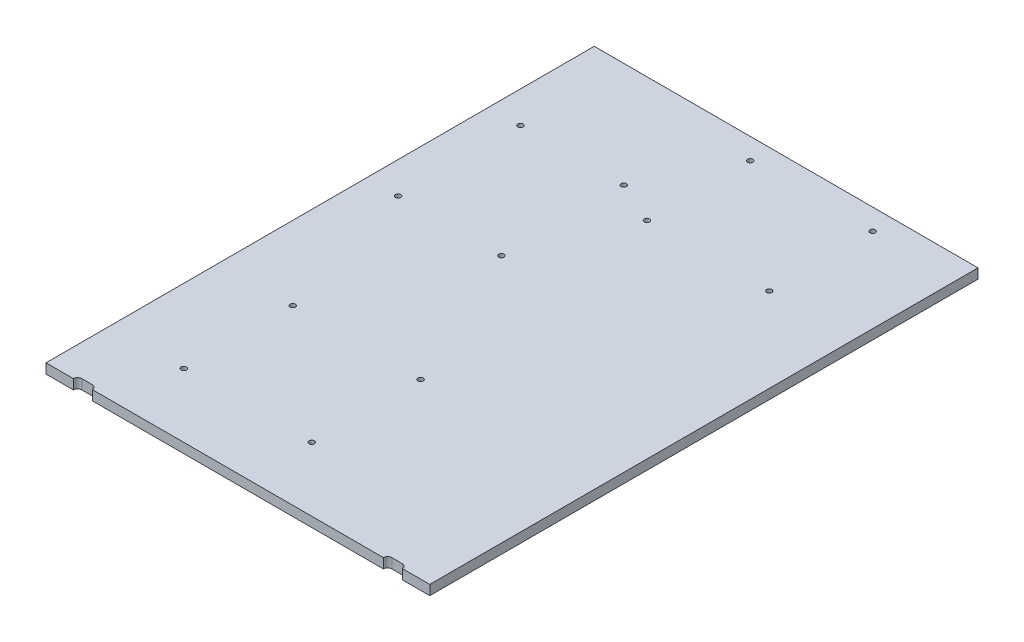
ISO-10303-21;
HEADER;
FILE_DESCRIPTION(('STEP AP214'),'2;1');
FILE_NAME('part.step','',(''),(''),'','','');
FILE_SCHEMA(('AUTOMOTIVE_DESIGN { 1 0 10303 214 1 1 1 1 }'));
ENDSEC;
DATA;
#1=APPLICATION_CONTEXT('core data for automotive mechanical design processes');
#2=APPLICATION_PROTOCOL_DEFINITION('international standard','automotive_design',2000,#1);
#3=PRODUCT_CONTEXT('',#1,'mechanical');
#4=PRODUCT('Part','Part','',(#3));
#5=PRODUCT_RELATED_PRODUCT_CATEGORY('part','',(#4));
#6=PRODUCT_DEFINITION_FORMATION('','',#4);
#7=PRODUCT_DEFINITION_CONTEXT('part definition',#1,'design');
#8=PRODUCT_DEFINITION('design','',#6,#7);
#9=PRODUCT_DEFINITION_SHAPE('','',#8);
#10=(LENGTH_UNIT() NAMED_UNIT(*) SI_UNIT(.MILLI.,.METRE.));
#11=(NAMED_UNIT(*) PLANE_ANGLE_UNIT() SI_UNIT($,.RADIAN.));
#12=(NAMED_UNIT(*) SI_UNIT($,.STERADIAN.) SOLID_ANGLE_UNIT());
#13=UNCERTAINTY_MEASURE_WITH_UNIT(LENGTH_MEASURE(1.E-05),#10,'distance_accuracy_value','');
#14=(GEOMETRIC_REPRESENTATION_CONTEXT(3) GLOBAL_UNCERTAINTY_ASSIGNED_CONTEXT((#13)) GLOBAL_UNIT_ASSIGNED_CONTEXT((#10,
#11,#12)) REPRESENTATION_CONTEXT('',''));
#15=CARTESIAN_POINT('',(0.,0.,0.));
#16=DIRECTION('',(0.,0.,1.));
#17=DIRECTION('',(1.,0.,0.));
#18=AXIS2_PLACEMENT_3D('',#15,#16,#17);
#19=CARTESIAN_POINT('',(0.,4.65,0.));
#20=DIRECTION('',(0.,0.,-1.));
#21=DIRECTION('',(-1.,0.,0.));
#22=AXIS2_PLACEMENT_3D('',#19,#20,#21);
#23=PLANE('',#22);
#24=DIRECTION('',(1.,0.,0.));
#25=VECTOR('',#24,1.);
#26=CARTESIAN_POINT('',(0.,0.,0.));
#27=LINE('',#26,#25);
#28=CARTESIAN_POINT('',(0.,0.,0.));
#29=VERTEX_POINT('',#28);
#30=CARTESIAN_POINT('',(13.,0.,0.));
#31=VERTEX_POINT('',#30);
#32=EDGE_CURVE('E138',#29,#31,#27,.T.);
#33=ORIENTED_EDGE('',*,*,#32,.T.);
#34=DIRECTION('',(0.,1.,0.));
#35=VECTOR('',#34,1.);
#36=CARTESIAN_POINT('',(13.,-0.00100000000000013,0.));
#37=LINE('',#36,#35);
#38=CARTESIAN_POINT('',(13.,4.65,0.));
#39=VERTEX_POINT('',#38);
#40=EDGE_CURVE('E121',#31,#39,#37,.T.);
#41=ORIENTED_EDGE('',*,*,#40,.T.);
#42=DIRECTION('',(1.,0.,0.));
#43=VECTOR('',#42,1.);
#44=CARTESIAN_POINT('',(0.,4.65,0.));
#45=LINE('',#44,#43);
#46=CARTESIAN_POINT('',(0.,4.65,0.));
#47=VERTEX_POINT('',#46);
#48=EDGE_CURVE('E168',#47,#39,#45,.T.);
#49=ORIENTED_EDGE('',*,*,#48,.F.);
#50=DIRECTION('',(0.,-1.,0.));
#51=VECTOR('',#50,1.);
#52=CARTESIAN_POINT('',(0.,4.65,0.));
#53=LINE('',#52,#51);
#54=EDGE_CURVE('E11',#47,#29,#53,.T.);
#55=ORIENTED_EDGE('',*,*,#54,.T.);
#56=EDGE_LOOP('',(#33,#41,#49,#55));
#57=FACE_BOUND('',#56,.T.);
#58=ADVANCED_FACE('F33',(#57),#23,.F.);
#59=CARTESIAN_POINT('',(22.,4.65,0.));
#60=VERTEX_POINT('',#59);
#61=CARTESIAN_POINT('',(160.,4.65,0.));
#62=VERTEX_POINT('',#61);
#63=EDGE_CURVE('E170',#60,#62,#45,.T.);
#64=ORIENTED_EDGE('',*,*,#63,.F.);
#65=DIRECTION('',(0.,1.,0.));
#66=VECTOR('',#65,1.);
#67=CARTESIAN_POINT('',(22.,-0.00100000000000013,0.));
#68=LINE('',#67,#66);
#69=CARTESIAN_POINT('',(22.,0.,0.));
#70=VERTEX_POINT('',#69);
#71=EDGE_CURVE('E131',#70,#60,#68,.T.);
#72=ORIENTED_EDGE('',*,*,#71,.F.);
#73=CARTESIAN_POINT('',(160.,0.,0.));
#74=VERTEX_POINT('',#73);
#75=EDGE_CURVE('E145',#70,#74,#27,.T.);
#76=ORIENTED_EDGE('',*,*,#75,.T.);
#77=DIRECTION('',(0.,1.,0.));
#78=VECTOR('',#77,1.);
#79=CARTESIAN_POINT('',(160.,-0.00100000000000013,0.));
#80=LINE('',#79,#78);
#81=EDGE_CURVE('E175',#74,#62,#80,.T.);
#82=ORIENTED_EDGE('',*,*,#81,.T.);
#83=EDGE_LOOP('',(#64,#72,#76,#82));
#84=FACE_BOUND('',#83,.T.);
#85=ADVANCED_FACE('F302',(#84),#23,.F.);
#86=CARTESIAN_POINT('',(0.,4.65,0.));
#87=DIRECTION('',(1.,0.,0.));
#88=DIRECTION('',(0.,0.,-1.));
#89=AXIS2_PLACEMENT_3D('',#86,#87,#88);
#90=PLANE('',#89);
#91=DIRECTION('',(0.,0.,1.));
#92=VECTOR('',#91,1.);
#93=CARTESIAN_POINT('',(0.,0.,0.));
#94=LINE('',#93,#92);
#95=CARTESIAN_POINT('',(0.,0.,-260.));
#96=VERTEX_POINT('',#95);
#97=EDGE_CURVE('E152',#96,#29,#94,.T.);
#98=ORIENTED_EDGE('',*,*,#97,.T.);
#99=ORIENTED_EDGE('',*,*,#54,.F.);
#100=DIRECTION('',(0.,0.,1.));
#101=VECTOR('',#100,1.);
#102=CARTESIAN_POINT('',(0.,4.65,0.));
#103=LINE('',#102,#101);
#104=CARTESIAN_POINT('',(0.,4.65,-260.));
#105=VERTEX_POINT('',#104);
#106=EDGE_CURVE('E172',#105,#47,#103,.T.);
#107=ORIENTED_EDGE('',*,*,#106,.F.);
#108=DIRECTION('',(0.,-1.,0.));
#109=VECTOR('',#108,1.);
#110=CARTESIAN_POINT('',(0.,4.65,-260.));
#111=LINE('',#110,#109);
#112=EDGE_CURVE('E165',#105,#96,#111,.T.);
#113=ORIENTED_EDGE('',*,*,#112,.T.);
#114=EDGE_LOOP('',(#98,#99,#107,#113));
#115=FACE_BOUND('',#114,.T.);
#116=ADVANCED_FACE('F35',(#115),#90,.F.);
#117=CARTESIAN_POINT('',(169.,4.65,0.));
#118=VERTEX_POINT('',#117);
#119=CARTESIAN_POINT('',(182.,4.65,0.));
#120=VERTEX_POINT('',#119);
#121=EDGE_CURVE('E171',#118,#120,#45,.T.);
#122=ORIENTED_EDGE('',*,*,#121,.F.);
#123=DIRECTION('',(0.,1.,0.));
#124=VECTOR('',#123,1.);
#125=CARTESIAN_POINT('',(169.,-0.00100000000000013,0.));
#126=LINE('',#125,#124);
#127=CARTESIAN_POINT('',(169.,0.,0.));
#128=VERTEX_POINT('',#127);
#129=EDGE_CURVE('E178',#128,#118,#126,.T.);
#130=ORIENTED_EDGE('',*,*,#129,.F.);
#131=CARTESIAN_POINT('',(182.,0.,0.));
#132=VERTEX_POINT('',#131);
#133=EDGE_CURVE('E147',#128,#132,#27,.T.);
#134=ORIENTED_EDGE('',*,*,#133,.T.);
#135=DIRECTION('',(0.,-1.,0.));
#136=VECTOR('',#135,1.);
#137=CARTESIAN_POINT('',(182.,4.65,0.));
#138=LINE('',#137,#136);
#139=EDGE_CURVE('E41',#120,#132,#138,.T.);
#140=ORIENTED_EDGE('',*,*,#139,.F.);
#141=EDGE_LOOP('',(#122,#130,#134,#140));
#142=FACE_BOUND('',#141,.T.);
#143=ADVANCED_FACE('F301',(#142),#23,.F.);
#144=CARTESIAN_POINT('',(182.,4.65,0.));
#145=DIRECTION('',(-1.,0.,0.));
#146=DIRECTION('',(0.,0.,1.));
#147=AXIS2_PLACEMENT_3D('',#144,#145,#146);
#148=PLANE('',#147);
#149=DIRECTION('',(0.,0.,-1.));
#150=VECTOR('',#149,1.);
#151=CARTESIAN_POINT('',(182.,0.,0.));
#152=LINE('',#151,#150);
#153=CARTESIAN_POINT('',(182.,0.,-260.));
#154=VERTEX_POINT('',#153);
#155=EDGE_CURVE('E144',#132,#154,#152,.T.);
#156=ORIENTED_EDGE('',*,*,#155,.T.);
#157=DIRECTION('',(0.,-1.,0.));
#158=VECTOR('',#157,1.);
#159=CARTESIAN_POINT('',(182.,4.65,-260.));
#160=LINE('',#159,#158);
#161=CARTESIAN_POINT('',(182.,4.65,-260.));
#162=VERTEX_POINT('',#161);
#163=EDGE_CURVE('E601',#162,#154,#160,.T.);
#164=ORIENTED_EDGE('',*,*,#163,.F.);
#165=DIRECTION('',(0.,0.,-1.));
#166=VECTOR('',#165,1.);
#167=CARTESIAN_POINT('',(182.,4.65,0.));
#168=LINE('',#167,#166);
#169=EDGE_CURVE('E166',#120,#162,#168,.T.);
#170=ORIENTED_EDGE('',*,*,#169,.F.);
#171=ORIENTED_EDGE('',*,*,#139,.T.);
#172=EDGE_LOOP('',(#156,#164,#170,#171));
#173=FACE_BOUND('',#172,.T.);
#174=ADVANCED_FACE('F307',(#173),#148,.F.);
#175=CARTESIAN_POINT('',(0.,4.65,-260.));
#176=DIRECTION('',(0.,0.,1.));
#177=DIRECTION('',(1.,0.,0.));
#178=AXIS2_PLACEMENT_3D('',#175,#176,#177);
#179=PLANE('',#178);
#180=DIRECTION('',(-1.,0.,0.));
#181=VECTOR('',#180,1.);
#182=CARTESIAN_POINT('',(0.,0.,-260.));
#183=LINE('',#182,#181);
#184=EDGE_CURVE('E148',#154,#96,#183,.T.);
#185=ORIENTED_EDGE('',*,*,#184,.T.);
#186=ORIENTED_EDGE('',*,*,#112,.F.);
#187=DIRECTION('',(-1.,0.,0.));
#188=VECTOR('',#187,1.);
#189=CARTESIAN_POINT('',(0.,4.65,-260.));
#190=LINE('',#189,#188);
#191=EDGE_CURVE('E163',#162,#105,#190,.T.);
#192=ORIENTED_EDGE('',*,*,#191,.F.);
#193=ORIENTED_EDGE('',*,*,#163,.T.);
#194=EDGE_LOOP('',(#185,#186,#192,#193));
#195=FACE_BOUND('',#194,.T.);
#196=ADVANCED_FACE('F287',(#195),#179,.F.);
#197=CARTESIAN_POINT('',(0.,4.65,0.));
#198=DIRECTION('',(0.,-1.,0.));
#199=DIRECTION('',(0.,0.,-1.));
#200=AXIS2_PLACEMENT_3D('',#197,#198,#199);
#201=PLANE('',#200);
#202=CARTESIAN_POINT('',(64.,4.65,-210.));
#203=DIRECTION('',(0.,1.,0.));
#204=DIRECTION('',(0.,0.,1.));
#205=AXIS2_PLACEMENT_3D('',#202,#203,#204);
#206=CIRCLE('',#205,1.25);
#207=CARTESIAN_POINT('',(64.,4.65,-208.75));
#208=VERTEX_POINT('',#207);
#209=EDGE_CURVE('E232',#208,#208,#206,.T.);
#210=ORIENTED_EDGE('',*,*,#209,.F.);
#211=EDGE_LOOP('',(#210));
#212=FACE_BOUND('',#211,.T.);
#213=CARTESIAN_POINT('',(64.,4.65,-152.));
#214=DIRECTION('',(0.,1.,0.));
#215=DIRECTION('',(0.,0.,1.));
#216=AXIS2_PLACEMENT_3D('',#213,#214,#215);
#217=CIRCLE('',#216,1.25);
#218=CARTESIAN_POINT('',(64.,4.65,-150.75));
#219=VERTEX_POINT('',#218);
#220=EDGE_CURVE('E243',#219,#219,#217,.T.);
#221=ORIENTED_EDGE('',*,*,#220,.F.);
#222=EDGE_LOOP('',(#221));
#223=FACE_BOUND('',#222,.T.);
#224=CARTESIAN_POINT('',(15.,4.65,-152.));
#225=DIRECTION('',(0.,1.,0.));
#226=DIRECTION('',(0.,0.,1.));
#227=AXIS2_PLACEMENT_3D('',#224,#225,#226);
#228=CIRCLE('',#227,1.25);
#229=CARTESIAN_POINT('',(15.,4.65,-150.75));
#230=VERTEX_POINT('',#229);
#231=EDGE_CURVE('E244',#230,#230,#228,.T.);
#232=ORIENTED_EDGE('',*,*,#231,.F.);
#233=EDGE_LOOP('',(#232));
#234=FACE_BOUND('',#233,.T.);
#235=CARTESIAN_POINT('',(84.,4.65,-250.));
#236=DIRECTION('',(0.,1.,0.));
#237=DIRECTION('',(0.,0.,1.));
#238=AXIS2_PLACEMENT_3D('',#235,#236,#237);
#239=CIRCLE('',#238,1.25);
#240=CARTESIAN_POINT('',(84.,4.65,-248.75));
#241=VERTEX_POINT('',#240);
#242=EDGE_CURVE('E255',#241,#241,#239,.T.);
#243=ORIENTED_EDGE('',*,*,#242,.F.);
#244=EDGE_LOOP('',(#243));
#245=FACE_BOUND('',#244,.T.);
#246=CARTESIAN_POINT('',(95.65,4.65,-30.36));
#247=DIRECTION('',(0.,1.,0.));
#248=DIRECTION('',(0.,0.,1.));
#249=AXIS2_PLACEMENT_3D('',#246,#247,#248);
#250=CIRCLE('',#249,1.25);
#251=CARTESIAN_POINT('',(95.65,4.65,-29.11));
#252=VERTEX_POINT('',#251);
#253=EDGE_CURVE('E213',#252,#252,#250,.T.);
#254=ORIENTED_EDGE('',*,*,#253,.F.);
#255=EDGE_LOOP('',(#254));
#256=FACE_BOUND('',#255,.T.);
#257=CARTESIAN_POINT('',(35.,4.65,-82.));
#258=DIRECTION('',(0.,1.,0.));
#259=DIRECTION('',(0.,0.,1.));
#260=AXIS2_PLACEMENT_3D('',#257,#258,#259);
#261=CIRCLE('',#260,1.25);
#262=CARTESIAN_POINT('',(35.,4.65,-80.75));
#263=VERTEX_POINT('',#262);
#264=EDGE_CURVE('E219',#263,#263,#261,.T.);
#265=ORIENTED_EDGE('',*,*,#264,.F.);
#266=EDGE_LOOP('',(#265));
#267=FACE_BOUND('',#266,.T.);
#268=CARTESIAN_POINT('',(95.65,4.65,-82.));
#269=DIRECTION('',(0.,1.,0.));
#270=DIRECTION('',(0.,0.,1.));
#271=AXIS2_PLACEMENT_3D('',#268,#269,#270);
#272=CIRCLE('',#271,1.25);
#273=CARTESIAN_POINT('',(95.65,4.65,-80.75));
#274=VERTEX_POINT('',#273);
#275=EDGE_CURVE('E220',#274,#274,#272,.T.);
#276=ORIENTED_EDGE('',*,*,#275,.F.);
#277=EDGE_LOOP('',(#276));
#278=FACE_BOUND('',#277,.T.);
#279=CARTESIAN_POINT('',(15.,4.65,-210.));
#280=DIRECTION('',(0.,1.,0.));
#281=DIRECTION('',(0.,0.,1.));
#282=AXIS2_PLACEMENT_3D('',#279,#280,#281);
#283=CIRCLE('',#282,1.25);
#284=CARTESIAN_POINT('',(15.,4.65,-208.75));
#285=VERTEX_POINT('',#284);
#286=EDGE_CURVE('E231',#285,#285,#283,.T.);
#287=ORIENTED_EDGE('',*,*,#286,.F.);
#288=EDGE_LOOP('',(#287));
#289=FACE_BOUND('',#288,.T.);
#290=CARTESIAN_POINT('',(142.,4.65,-201.));
#291=DIRECTION('',(0.,1.,0.));
#292=DIRECTION('',(0.,0.,1.));
#293=AXIS2_PLACEMENT_3D('',#290,#291,#292);
#294=CIRCLE('',#293,1.25000000000001);
#295=CARTESIAN_POINT('',(142.,4.65,-199.75));
#296=VERTEX_POINT('',#295);
#297=EDGE_CURVE('E268',#296,#296,#294,.T.);
#298=ORIENTED_EDGE('',*,*,#297,.F.);
#299=EDGE_LOOP('',(#298));
#300=FACE_BOUND('',#299,.T.);
#301=CARTESIAN_POINT('',(84.,4.65,-201.));
#302=DIRECTION('',(0.,1.,0.));
#303=DIRECTION('',(0.,0.,1.));
#304=AXIS2_PLACEMENT_3D('',#301,#302,#303);
#305=CIRCLE('',#304,1.25);
#306=CARTESIAN_POINT('',(84.,4.65,-199.75));
#307=VERTEX_POINT('',#306);
#308=EDGE_CURVE('E267',#307,#307,#305,.T.);
#309=ORIENTED_EDGE('',*,*,#308,.F.);
#310=EDGE_LOOP('',(#309));
#311=FACE_BOUND('',#310,.T.);
#312=CARTESIAN_POINT('',(142.,4.65,-250.));
#313=DIRECTION('',(0.,1.,0.));
#314=DIRECTION('',(0.,0.,1.));
#315=AXIS2_PLACEMENT_3D('',#312,#313,#314);
#316=CIRCLE('',#315,1.25000000000001);
#317=CARTESIAN_POINT('',(142.,4.65,-248.75));
#318=VERTEX_POINT('',#317);
#319=EDGE_CURVE('E256',#318,#318,#316,.T.);
#320=ORIENTED_EDGE('',*,*,#319,.F.);
#321=EDGE_LOOP('',(#320));
#322=FACE_BOUND('',#321,.T.);
#323=CARTESIAN_POINT('',(35.,4.65,-30.36));
#324=DIRECTION('',(0.,1.,0.));
#325=DIRECTION('',(0.,0.,1.));
#326=AXIS2_PLACEMENT_3D('',#323,#324,#325);
#327=CIRCLE('',#326,1.25);
#328=CARTESIAN_POINT('',(35.,4.65,-29.11));
#329=VERTEX_POINT('',#328);
#330=EDGE_CURVE('E199',#329,#329,#327,.T.);
#331=ORIENTED_EDGE('',*,*,#330,.F.);
#332=EDGE_LOOP('',(#331));
#333=FACE_BOUND('',#332,.T.);
#334=ORIENTED_EDGE('',*,*,#48,.T.);
#335=CARTESIAN_POINT('',(15.,4.65,0.));
#336=DIRECTION('',(0.,1.,0.));
#337=DIRECTION('',(0.,0.,1.));
#338=AXIS2_PLACEMENT_3D('',#335,#336,#337);
#339=CIRCLE('',#338,2.);
#340=CARTESIAN_POINT('',(15.,4.65,-2.));
#341=VERTEX_POINT('',#340);
#342=EDGE_CURVE('E127',#341,#39,#339,.T.);
#343=ORIENTED_EDGE('',*,*,#342,.F.);
#344=DIRECTION('',(-1.,0.,0.));
#345=VECTOR('',#344,1.);
#346=CARTESIAN_POINT('',(15.,4.65,-2.));
#347=LINE('',#346,#345);
#348=CARTESIAN_POINT('',(20.,4.65,-2.));
#349=VERTEX_POINT('',#348);
#350=EDGE_CURVE('E132',#349,#341,#347,.T.);
#351=ORIENTED_EDGE('',*,*,#350,.F.);
#352=CARTESIAN_POINT('',(20.,4.65,0.));
#353=DIRECTION('',(0.,1.,0.));
#354=DIRECTION('',(0.,0.,1.));
#355=AXIS2_PLACEMENT_3D('',#352,#353,#354);
#356=CIRCLE('',#355,2.);
#357=EDGE_CURVE('E205',#60,#349,#356,.T.);
#358=ORIENTED_EDGE('',*,*,#357,.F.);
#359=ORIENTED_EDGE('',*,*,#63,.T.);
#360=CARTESIAN_POINT('',(162.,4.65,0.));
#361=DIRECTION('',(0.,1.,0.));
#362=DIRECTION('',(0.,0.,1.));
#363=AXIS2_PLACEMENT_3D('',#360,#361,#362);
#364=CIRCLE('',#363,2.);
#365=CARTESIAN_POINT('',(162.,4.65,-2.));
#366=VERTEX_POINT('',#365);
#367=EDGE_CURVE('E189',#366,#62,#364,.T.);
#368=ORIENTED_EDGE('',*,*,#367,.F.);
#369=DIRECTION('',(-1.,0.,0.));
#370=VECTOR('',#369,1.);
#371=CARTESIAN_POINT('',(162.,4.65,-2.));
#372=LINE('',#371,#370);
#373=CARTESIAN_POINT('',(167.,4.65,-2.));
#374=VERTEX_POINT('',#373);
#375=EDGE_CURVE('E179',#374,#366,#372,.T.);
#376=ORIENTED_EDGE('',*,*,#375,.F.);
#377=CARTESIAN_POINT('',(167.,4.65,0.));
#378=DIRECTION('',(0.,1.,0.));
#379=DIRECTION('',(0.,0.,1.));
#380=AXIS2_PLACEMENT_3D('',#377,#378,#379);
#381=CIRCLE('',#380,2.);
#382=EDGE_CURVE('E187',#118,#374,#381,.T.);
#383=ORIENTED_EDGE('',*,*,#382,.F.);
#384=ORIENTED_EDGE('',*,*,#121,.T.);
#385=ORIENTED_EDGE('',*,*,#169,.T.);
#386=ORIENTED_EDGE('',*,*,#191,.T.);
#387=ORIENTED_EDGE('',*,*,#106,.T.);
#388=EDGE_LOOP('',(#334,#343,#351,#358,#359,#368,#376,#383,#384,#385,#386,#387));
#389=FACE_BOUND('',#388,.T.);
#390=ADVANCED_FACE('F284',(#212,#223,#234,#245,#256,#267,#278,#289,#300,#311,#322,#333,#389),
#201,.F.);
#391=CARTESIAN_POINT('',(0.,0.,0.));
#392=DIRECTION('',(0.,-1.,0.));
#393=DIRECTION('',(0.,0.,-1.));
#394=AXIS2_PLACEMENT_3D('',#391,#392,#393);
#395=PLANE('',#394);
#396=CARTESIAN_POINT('',(64.,0.,-210.));
#397=DIRECTION('',(0.,-1.,0.));
#398=DIRECTION('',(0.,0.,-1.));
#399=AXIS2_PLACEMENT_3D('',#396,#397,#398);
#400=CIRCLE('',#399,1.25);
#401=CARTESIAN_POINT('',(64.,0.,-211.25));
#402=VERTEX_POINT('',#401);
#403=EDGE_CURVE('E247',#402,#402,#400,.F.);
#404=ORIENTED_EDGE('',*,*,#403,.T.);
#405=EDGE_LOOP('',(#404));
#406=FACE_BOUND('',#405,.T.);
#407=CARTESIAN_POINT('',(64.,0.,-152.));
#408=DIRECTION('',(0.,-1.,0.));
#409=DIRECTION('',(0.,0.,-1.));
#410=AXIS2_PLACEMENT_3D('',#407,#408,#409);
#411=CIRCLE('',#410,1.25);
#412=CARTESIAN_POINT('',(64.,0.,-153.25));
#413=VERTEX_POINT('',#412);
#414=EDGE_CURVE('E240',#413,#413,#411,.F.);
#415=ORIENTED_EDGE('',*,*,#414,.T.);
#416=EDGE_LOOP('',(#415));
#417=FACE_BOUND('',#416,.T.);
#418=CARTESIAN_POINT('',(15.,0.,-152.));
#419=DIRECTION('',(0.,-1.,0.));
#420=DIRECTION('',(0.,0.,-1.));
#421=AXIS2_PLACEMENT_3D('',#418,#419,#420);
#422=CIRCLE('',#421,1.25);
#423=CARTESIAN_POINT('',(15.,0.,-153.25));
#424=VERTEX_POINT('',#423);
#425=EDGE_CURVE('E259',#424,#424,#422,.F.);
#426=ORIENTED_EDGE('',*,*,#425,.T.);
#427=EDGE_LOOP('',(#426));
#428=FACE_BOUND('',#427,.T.);
#429=CARTESIAN_POINT('',(84.,0.,-250.));
#430=DIRECTION('',(0.,-1.,0.));
#431=DIRECTION('',(0.,0.,-1.));
#432=AXIS2_PLACEMENT_3D('',#429,#430,#431);
#433=CIRCLE('',#432,1.25);
#434=CARTESIAN_POINT('',(84.,0.,-251.25));
#435=VERTEX_POINT('',#434);
#436=EDGE_CURVE('E252',#435,#435,#433,.F.);
#437=ORIENTED_EDGE('',*,*,#436,.T.);
#438=EDGE_LOOP('',(#437));
#439=FACE_BOUND('',#438,.T.);
#440=CARTESIAN_POINT('',(95.65,0.,-30.36));
#441=DIRECTION('',(0.,-1.,0.));
#442=DIRECTION('',(0.,0.,-1.));
#443=AXIS2_PLACEMENT_3D('',#440,#441,#442);
#444=CIRCLE('',#443,1.25);
#445=CARTESIAN_POINT('',(95.65,0.,-31.61));
#446=VERTEX_POINT('',#445);
#447=EDGE_CURVE('E223',#446,#446,#444,.F.);
#448=ORIENTED_EDGE('',*,*,#447,.T.);
#449=EDGE_LOOP('',(#448));
#450=FACE_BOUND('',#449,.T.);
#451=CARTESIAN_POINT('',(35.,0.,-82.));
#452=DIRECTION('',(0.,-1.,0.));
#453=DIRECTION('',(0.,0.,-1.));
#454=AXIS2_PLACEMENT_3D('',#451,#452,#453);
#455=CIRCLE('',#454,1.25);
#456=CARTESIAN_POINT('',(35.,0.,-83.25));
#457=VERTEX_POINT('',#456);
#458=EDGE_CURVE('E216',#457,#457,#455,.F.);
#459=ORIENTED_EDGE('',*,*,#458,.T.);
#460=EDGE_LOOP('',(#459));
#461=FACE_BOUND('',#460,.T.);
#462=CARTESIAN_POINT('',(95.65,0.,-82.));
#463=DIRECTION('',(0.,-1.,0.));
#464=DIRECTION('',(0.,0.,-1.));
#465=AXIS2_PLACEMENT_3D('',#462,#463,#464);
#466=CIRCLE('',#465,1.25);
#467=CARTESIAN_POINT('',(95.65,0.,-83.25));
#468=VERTEX_POINT('',#467);
#469=EDGE_CURVE('E235',#468,#468,#466,.F.);
#470=ORIENTED_EDGE('',*,*,#469,.T.);
#471=EDGE_LOOP('',(#470));
#472=FACE_BOUND('',#471,.T.);
#473=CARTESIAN_POINT('',(15.,0.,-210.));
#474=DIRECTION('',(0.,-1.,0.));
#475=DIRECTION('',(0.,0.,-1.));
#476=AXIS2_PLACEMENT_3D('',#473,#474,#475);
#477=CIRCLE('',#476,1.25);
#478=CARTESIAN_POINT('',(15.,0.,-211.25));
#479=VERTEX_POINT('',#478);
#480=EDGE_CURVE('E228',#479,#479,#477,.F.);
#481=ORIENTED_EDGE('',*,*,#480,.T.);
#482=EDGE_LOOP('',(#481));
#483=FACE_BOUND('',#482,.T.);
#484=CARTESIAN_POINT('',(142.,0.,-201.));
#485=DIRECTION('',(0.,-1.,0.));
#486=DIRECTION('',(0.,0.,-1.));
#487=AXIS2_PLACEMENT_3D('',#484,#485,#486);
#488=CIRCLE('',#487,1.25000000000001);
#489=CARTESIAN_POINT('',(142.,0.,-202.25));
#490=VERTEX_POINT('',#489);
#491=EDGE_CURVE('E276',#490,#490,#488,.F.);
#492=ORIENTED_EDGE('',*,*,#491,.T.);
#493=EDGE_LOOP('',(#492));
#494=FACE_BOUND('',#493,.T.);
#495=CARTESIAN_POINT('',(84.,0.,-201.));
#496=DIRECTION('',(0.,-1.,0.));
#497=DIRECTION('',(0.,0.,-1.));
#498=AXIS2_PLACEMENT_3D('',#495,#496,#497);
#499=CIRCLE('',#498,1.25);
#500=CARTESIAN_POINT('',(84.,0.,-202.25));
#501=VERTEX_POINT('',#500);
#502=EDGE_CURVE('E264',#501,#501,#499,.F.);
#503=ORIENTED_EDGE('',*,*,#502,.T.);
#504=EDGE_LOOP('',(#503));
#505=FACE_BOUND('',#504,.T.);
#506=CARTESIAN_POINT('',(142.,0.,-250.));
#507=DIRECTION('',(0.,-1.,0.));
#508=DIRECTION('',(0.,0.,-1.));
#509=AXIS2_PLACEMENT_3D('',#506,#507,#508);
#510=CIRCLE('',#509,1.25000000000001);
#511=CARTESIAN_POINT('',(142.,0.,-251.25));
#512=VERTEX_POINT('',#511);
#513=EDGE_CURVE('E271',#512,#512,#510,.F.);
#514=ORIENTED_EDGE('',*,*,#513,.T.);
#515=EDGE_LOOP('',(#514));
#516=FACE_BOUND('',#515,.T.);
#517=CARTESIAN_POINT('',(35.,0.,-30.36));
#518=DIRECTION('',(0.,-1.,0.));
#519=DIRECTION('',(0.,0.,-1.));
#520=AXIS2_PLACEMENT_3D('',#517,#518,#519);
#521=CIRCLE('',#520,1.25);
#522=CARTESIAN_POINT('',(35.,0.,-31.61));
#523=VERTEX_POINT('',#522);
#524=EDGE_CURVE('E210',#523,#523,#521,.F.);
#525=ORIENTED_EDGE('',*,*,#524,.T.);
#526=EDGE_LOOP('',(#525));
#527=FACE_BOUND('',#526,.T.);
#528=CARTESIAN_POINT('',(15.,0.,0.));
#529=DIRECTION('',(0.,-1.,0.));
#530=DIRECTION('',(0.,0.,-1.));
#531=AXIS2_PLACEMENT_3D('',#528,#529,#530);
#532=CIRCLE('',#531,2.);
#533=CARTESIAN_POINT('',(15.,0.,-2.));
#534=VERTEX_POINT('',#533);
#535=EDGE_CURVE('E124',#534,#31,#532,.F.);
#536=ORIENTED_EDGE('',*,*,#535,.T.);
#537=ORIENTED_EDGE('',*,*,#32,.F.);
#538=ORIENTED_EDGE('',*,*,#97,.F.);
#539=ORIENTED_EDGE('',*,*,#184,.F.);
#540=ORIENTED_EDGE('',*,*,#155,.F.);
#541=ORIENTED_EDGE('',*,*,#133,.F.);
#542=CARTESIAN_POINT('',(167.,0.,0.));
#543=DIRECTION('',(0.,-1.,0.));
#544=DIRECTION('',(0.,0.,-1.));
#545=AXIS2_PLACEMENT_3D('',#542,#543,#544);
#546=CIRCLE('',#545,2.);
#547=CARTESIAN_POINT('',(167.,0.,-2.));
#548=VERTEX_POINT('',#547);
#549=EDGE_CURVE('E197',#128,#548,#546,.F.);
#550=ORIENTED_EDGE('',*,*,#549,.T.);
#551=DIRECTION('',(-1.,0.,0.));
#552=VECTOR('',#551,1.);
#553=CARTESIAN_POINT('',(162.,0.,-2.));
#554=LINE('',#553,#552);
#555=CARTESIAN_POINT('',(162.,0.,-2.));
#556=VERTEX_POINT('',#555);
#557=EDGE_CURVE('E194',#548,#556,#554,.T.);
#558=ORIENTED_EDGE('',*,*,#557,.T.);
#559=CARTESIAN_POINT('',(162.,0.,0.));
#560=DIRECTION('',(0.,-1.,0.));
#561=DIRECTION('',(0.,0.,-1.));
#562=AXIS2_PLACEMENT_3D('',#559,#560,#561);
#563=CIRCLE('',#562,2.);
#564=EDGE_CURVE('E191',#556,#74,#563,.F.);
#565=ORIENTED_EDGE('',*,*,#564,.T.);
#566=ORIENTED_EDGE('',*,*,#75,.F.);
#567=CARTESIAN_POINT('',(20.,0.,0.));
#568=DIRECTION('',(0.,-1.,0.));
#569=DIRECTION('',(0.,0.,-1.));
#570=AXIS2_PLACEMENT_3D('',#567,#568,#569);
#571=CIRCLE('',#570,2.);
#572=CARTESIAN_POINT('',(20.,0.,-2.));
#573=VERTEX_POINT('',#572);
#574=EDGE_CURVE('E184',#70,#573,#571,.F.);
#575=ORIENTED_EDGE('',*,*,#574,.T.);
#576=DIRECTION('',(-1.,0.,0.));
#577=VECTOR('',#576,1.);
#578=CARTESIAN_POINT('',(15.,0.,-2.));
#579=LINE('',#578,#577);
#580=EDGE_CURVE('E140',#573,#534,#579,.T.);
#581=ORIENTED_EDGE('',*,*,#580,.T.);
#582=EDGE_LOOP('',(#536,#537,#538,#539,#540,#541,#550,#558,#565,#566,#575,#581));
#583=FACE_BOUND('',#582,.T.);
#584=ADVANCED_FACE('F136',(#406,#417,#428,#439,#450,#461,#472,#483,#494,#505,#516,#527,#583),
#395,.T.);
#585=CARTESIAN_POINT('',(162.,-0.00100000000000013,0.));
#586=DIRECTION('',(0.,1.,0.));
#587=DIRECTION('',(0.,0.,1.));
#588=AXIS2_PLACEMENT_3D('',#585,#586,#587);
#589=CYLINDRICAL_SURFACE('',#588,2.);
#590=DIRECTION('',(0.,1.,0.));
#591=VECTOR('',#590,1.);
#592=CARTESIAN_POINT('',(162.,-0.00100000000000013,-2.));
#593=LINE('',#592,#591);
#594=EDGE_CURVE('E182',#556,#366,#593,.T.);
#595=ORIENTED_EDGE('',*,*,#594,.T.);
#596=ORIENTED_EDGE('',*,*,#367,.T.);
#597=ORIENTED_EDGE('',*,*,#81,.F.);
#598=ORIENTED_EDGE('',*,*,#564,.F.);
#599=EDGE_LOOP('',(#595,#596,#597,#598));
#600=FACE_BOUND('',#599,.T.);
#601=ADVANCED_FACE('F322',(#600),#589,.F.);
#602=CARTESIAN_POINT('',(162.,-0.00100000000000013,-2.));
#603=DIRECTION('',(0.,0.,-1.));
#604=DIRECTION('',(-1.,0.,0.));
#605=AXIS2_PLACEMENT_3D('',#602,#603,#604);
#606=PLANE('',#605);
#607=DIRECTION('',(0.,1.,0.));
#608=VECTOR('',#607,1.);
#609=CARTESIAN_POINT('',(167.,-0.00100000000000013,-2.));
#610=LINE('',#609,#608);
#611=EDGE_CURVE('E56',#548,#374,#610,.T.);
#612=ORIENTED_EDGE('',*,*,#611,.T.);
#613=ORIENTED_EDGE('',*,*,#375,.T.);
#614=ORIENTED_EDGE('',*,*,#594,.F.);
#615=ORIENTED_EDGE('',*,*,#557,.F.);
#616=EDGE_LOOP('',(#612,#613,#614,#615));
#617=FACE_BOUND('',#616,.T.);
#618=ADVANCED_FACE('F327',(#617),#606,.F.);
#619=CARTESIAN_POINT('',(167.,-0.00100000000000013,0.));
#620=DIRECTION('',(0.,1.,0.));
#621=DIRECTION('',(0.,0.,1.));
#622=AXIS2_PLACEMENT_3D('',#619,#620,#621);
#623=CYLINDRICAL_SURFACE('',#622,2.);
#624=ORIENTED_EDGE('',*,*,#129,.T.);
#625=ORIENTED_EDGE('',*,*,#382,.T.);
#626=ORIENTED_EDGE('',*,*,#611,.F.);
#627=ORIENTED_EDGE('',*,*,#549,.F.);
#628=EDGE_LOOP('',(#624,#625,#626,#627));
#629=FACE_BOUND('',#628,.T.);
#630=ADVANCED_FACE('F329',(#629),#623,.F.);
#631=CARTESIAN_POINT('',(15.,-0.00100000000000013,0.));
#632=DIRECTION('',(0.,1.,0.));
#633=DIRECTION('',(0.,0.,1.));
#634=AXIS2_PLACEMENT_3D('',#631,#632,#633);
#635=CYLINDRICAL_SURFACE('',#634,2.);
#636=DIRECTION('',(0.,1.,0.));
#637=VECTOR('',#636,1.);
#638=CARTESIAN_POINT('',(15.,-0.00100000000000013,-2.));
#639=LINE('',#638,#637);
#640=EDGE_CURVE('E158',#534,#341,#639,.T.);
#641=ORIENTED_EDGE('',*,*,#640,.T.);
#642=ORIENTED_EDGE('',*,*,#342,.T.);
#643=ORIENTED_EDGE('',*,*,#40,.F.);
#644=ORIENTED_EDGE('',*,*,#535,.F.);
#645=EDGE_LOOP('',(#641,#642,#643,#644));
#646=FACE_BOUND('',#645,.T.);
#647=ADVANCED_FACE('F123',(#646),#635,.F.);
#648=CARTESIAN_POINT('',(15.,-0.00100000000000013,-2.));
#649=DIRECTION('',(0.,0.,-1.));
#650=DIRECTION('',(-1.,0.,0.));
#651=AXIS2_PLACEMENT_3D('',#648,#649,#650);
#652=PLANE('',#651);
#653=DIRECTION('',(0.,1.,0.));
#654=VECTOR('',#653,1.);
#655=CARTESIAN_POINT('',(20.,-0.00100000000000013,-2.));
#656=LINE('',#655,#654);
#657=EDGE_CURVE('E48',#573,#349,#656,.T.);
#658=ORIENTED_EDGE('',*,*,#657,.T.);
#659=ORIENTED_EDGE('',*,*,#350,.T.);
#660=ORIENTED_EDGE('',*,*,#640,.F.);
#661=ORIENTED_EDGE('',*,*,#580,.F.);
#662=EDGE_LOOP('',(#658,#659,#660,#661));
#663=FACE_BOUND('',#662,.T.);
#664=ADVANCED_FACE('F337',(#663),#652,.F.);
#665=CARTESIAN_POINT('',(20.,-0.00100000000000013,0.));
#666=DIRECTION('',(0.,1.,0.));
#667=DIRECTION('',(0.,0.,1.));
#668=AXIS2_PLACEMENT_3D('',#665,#666,#667);
#669=CYLINDRICAL_SURFACE('',#668,2.);
#670=ORIENTED_EDGE('',*,*,#71,.T.);
#671=ORIENTED_EDGE('',*,*,#357,.T.);
#672=ORIENTED_EDGE('',*,*,#657,.F.);
#673=ORIENTED_EDGE('',*,*,#574,.F.);
#674=EDGE_LOOP('',(#670,#671,#672,#673));
#675=FACE_BOUND('',#674,.T.);
#676=ADVANCED_FACE('F338',(#675),#669,.F.);
#677=CARTESIAN_POINT('',(35.,-0.00100000000000013,-30.36));
#678=DIRECTION('',(0.,1.,0.));
#679=DIRECTION('',(0.,0.,1.));
#680=AXIS2_PLACEMENT_3D('',#677,#678,#679);
#681=CYLINDRICAL_SURFACE('',#680,1.25);
#682=ORIENTED_EDGE('',*,*,#524,.F.);
#683=EDGE_LOOP('',(#682));
#684=FACE_BOUND('',#683,.T.);
#685=ORIENTED_EDGE('',*,*,#330,.T.);
#686=EDGE_LOOP('',(#685));
#687=FACE_BOUND('',#686,.T.);
#688=ADVANCED_FACE('F341',(#684,#687),#681,.F.);
#689=CARTESIAN_POINT('',(142.,-0.00100000000000013,-250.));
#690=DIRECTION('',(0.,1.,0.));
#691=DIRECTION('',(0.,0.,1.));
#692=AXIS2_PLACEMENT_3D('',#689,#690,#691);
#693=CYLINDRICAL_SURFACE('',#692,1.25000000000001);
#694=ORIENTED_EDGE('',*,*,#513,.F.);
#695=EDGE_LOOP('',(#694));
#696=FACE_BOUND('',#695,.T.);
#697=ORIENTED_EDGE('',*,*,#319,.T.);
#698=EDGE_LOOP('',(#697));
#699=FACE_BOUND('',#698,.T.);
#700=ADVANCED_FACE('F347',(#696,#699),#693,.F.);
#701=CARTESIAN_POINT('',(84.,-0.00100000000000013,-201.));
#702=DIRECTION('',(0.,1.,0.));
#703=DIRECTION('',(0.,0.,1.));
#704=AXIS2_PLACEMENT_3D('',#701,#702,#703);
#705=CYLINDRICAL_SURFACE('',#704,1.25);
#706=ORIENTED_EDGE('',*,*,#502,.F.);
#707=EDGE_LOOP('',(#706));
#708=FACE_BOUND('',#707,.T.);
#709=ORIENTED_EDGE('',*,*,#308,.T.);
#710=EDGE_LOOP('',(#709));
#711=FACE_BOUND('',#710,.T.);
#712=ADVANCED_FACE('F381',(#708,#711),#705,.F.);
#713=CARTESIAN_POINT('',(142.,-0.00100000000000013,-201.));
#714=DIRECTION('',(0.,1.,0.));
#715=DIRECTION('',(0.,0.,1.));
#716=AXIS2_PLACEMENT_3D('',#713,#714,#715);
#717=CYLINDRICAL_SURFACE('',#716,1.25000000000001);
#718=ORIENTED_EDGE('',*,*,#491,.F.);
#719=EDGE_LOOP('',(#718));
#720=FACE_BOUND('',#719,.T.);
#721=ORIENTED_EDGE('',*,*,#297,.T.);
#722=EDGE_LOOP('',(#721));
#723=FACE_BOUND('',#722,.T.);
#724=ADVANCED_FACE('F282',(#720,#723),#717,.F.);
#725=CARTESIAN_POINT('',(15.,-0.00100000000000013,-210.));
#726=DIRECTION('',(0.,1.,0.));
#727=DIRECTION('',(0.,0.,1.));
#728=AXIS2_PLACEMENT_3D('',#725,#726,#727);
#729=CYLINDRICAL_SURFACE('',#728,1.25);
#730=ORIENTED_EDGE('',*,*,#480,.F.);
#731=EDGE_LOOP('',(#730));
#732=FACE_BOUND('',#731,.T.);
#733=ORIENTED_EDGE('',*,*,#286,.T.);
#734=EDGE_LOOP('',(#733));
#735=FACE_BOUND('',#734,.T.);
#736=ADVANCED_FACE('F359',(#732,#735),#729,.F.);
#737=CARTESIAN_POINT('',(95.65,-0.00100000000000013,-82.));
#738=DIRECTION('',(0.,1.,0.));
#739=DIRECTION('',(0.,0.,1.));
#740=AXIS2_PLACEMENT_3D('',#737,#738,#739);
#741=CYLINDRICAL_SURFACE('',#740,1.25);
#742=ORIENTED_EDGE('',*,*,#469,.F.);
#743=EDGE_LOOP('',(#742));
#744=FACE_BOUND('',#743,.T.);
#745=ORIENTED_EDGE('',*,*,#275,.T.);
#746=EDGE_LOOP('',(#745));
#747=FACE_BOUND('',#746,.T.);
#748=ADVANCED_FACE('F353',(#744,#747),#741,.F.);
#749=CARTESIAN_POINT('',(35.,-0.00100000000000013,-82.));
#750=DIRECTION('',(0.,1.,0.));
#751=DIRECTION('',(0.,0.,1.));
#752=AXIS2_PLACEMENT_3D('',#749,#750,#751);
#753=CYLINDRICAL_SURFACE('',#752,1.25);
#754=ORIENTED_EDGE('',*,*,#458,.F.);
#755=EDGE_LOOP('',(#754));
#756=FACE_BOUND('',#755,.T.);
#757=ORIENTED_EDGE('',*,*,#264,.T.);
#758=EDGE_LOOP('',(#757));
#759=FACE_BOUND('',#758,.T.);
#760=ADVANCED_FACE('F349',(#756,#759),#753,.F.);
#761=CARTESIAN_POINT('',(95.65,-0.00100000000000013,-30.36));
#762=DIRECTION('',(0.,1.,0.));
#763=DIRECTION('',(0.,0.,1.));
#764=AXIS2_PLACEMENT_3D('',#761,#762,#763);
#765=CYLINDRICAL_SURFACE('',#764,1.25);
#766=ORIENTED_EDGE('',*,*,#447,.F.);
#767=EDGE_LOOP('',(#766));
#768=FACE_BOUND('',#767,.T.);
#769=ORIENTED_EDGE('',*,*,#253,.T.);
#770=EDGE_LOOP('',(#769));
#771=FACE_BOUND('',#770,.T.);
#772=ADVANCED_FACE('F352',(#768,#771),#765,.F.);
#773=CARTESIAN_POINT('',(84.,-0.00100000000000013,-250.));
#774=DIRECTION('',(0.,1.,0.));
#775=DIRECTION('',(0.,0.,1.));
#776=AXIS2_PLACEMENT_3D('',#773,#774,#775);
#777=CYLINDRICAL_SURFACE('',#776,1.25);
#778=ORIENTED_EDGE('',*,*,#436,.F.);
#779=EDGE_LOOP('',(#778));
#780=FACE_BOUND('',#779,.T.);
#781=ORIENTED_EDGE('',*,*,#242,.T.);
#782=EDGE_LOOP('',(#781));
#783=FACE_BOUND('',#782,.T.);
#784=ADVANCED_FACE('F357',(#780,#783),#777,.F.);
#785=CARTESIAN_POINT('',(15.,-0.00100000000000013,-152.));
#786=DIRECTION('',(0.,1.,0.));
#787=DIRECTION('',(0.,0.,1.));
#788=AXIS2_PLACEMENT_3D('',#785,#786,#787);
#789=CYLINDRICAL_SURFACE('',#788,1.25);
#790=ORIENTED_EDGE('',*,*,#425,.F.);
#791=EDGE_LOOP('',(#790));
#792=FACE_BOUND('',#791,.T.);
#793=ORIENTED_EDGE('',*,*,#231,.T.);
#794=EDGE_LOOP('',(#793));
#795=FACE_BOUND('',#794,.T.);
#796=ADVANCED_FACE('F370',(#792,#795),#789,.F.);
#797=CARTESIAN_POINT('',(64.,-0.00100000000000013,-152.));
#798=DIRECTION('',(0.,1.,0.));
#799=DIRECTION('',(0.,0.,1.));
#800=AXIS2_PLACEMENT_3D('',#797,#798,#799);
#801=CYLINDRICAL_SURFACE('',#800,1.25);
#802=ORIENTED_EDGE('',*,*,#414,.F.);
#803=EDGE_LOOP('',(#802));
#804=FACE_BOUND('',#803,.T.);
#805=ORIENTED_EDGE('',*,*,#220,.T.);
#806=EDGE_LOOP('',(#805));
#807=FACE_BOUND('',#806,.T.);
#808=ADVANCED_FACE('F366',(#804,#807),#801,.F.);
#809=CARTESIAN_POINT('',(64.,-0.00100000000000013,-210.));
#810=DIRECTION('',(0.,1.,0.));
#811=DIRECTION('',(0.,0.,1.));
#812=AXIS2_PLACEMENT_3D('',#809,#810,#811);
#813=CYLINDRICAL_SURFACE('',#812,1.25);
#814=ORIENTED_EDGE('',*,*,#403,.F.);
#815=EDGE_LOOP('',(#814));
#816=FACE_BOUND('',#815,.T.);
#817=ORIENTED_EDGE('',*,*,#209,.T.);
#818=EDGE_LOOP('',(#817));
#819=FACE_BOUND('',#818,.T.);
#820=ADVANCED_FACE('F369',(#816,#819),#813,.F.);
#821=CLOSED_SHELL('',(#58,#85,#116,#143,#174,#196,#390,#584,#601,#618,#630,#647,#664,#676,#688,
#700,#712,#724,#736,#748,#760,#772,#784,#796,#808,#820));
#822=MANIFOLD_SOLID_BREP('B2',#821);
#823=ADVANCED_BREP_SHAPE_REPRESENTATION('',(#18,#822),#14);
#824=SHAPE_DEFINITION_REPRESENTATION(#9,#823);
ENDSEC;
END-ISO-10303-21;
